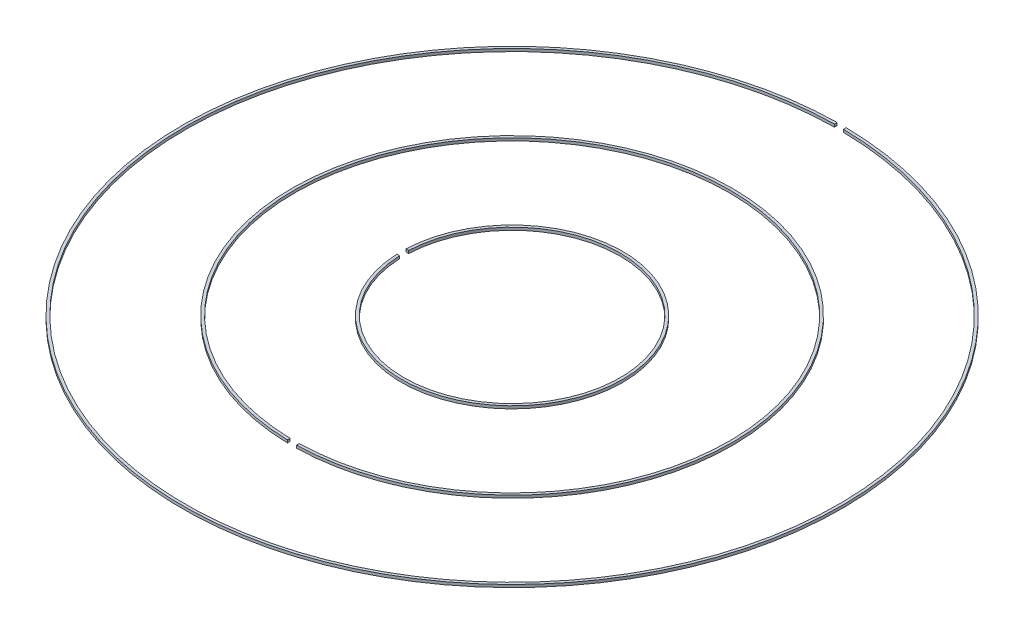
ISO-10303-21;
HEADER;
FILE_DESCRIPTION(('STEP AP214'),'2;1');
FILE_NAME('part.step','',(''),(''),'','','');
FILE_SCHEMA(('AUTOMOTIVE_DESIGN { 1 0 10303 214 1 1 1 1 }'));
ENDSEC;
DATA;
#1=APPLICATION_CONTEXT('core data for automotive mechanical design processes');
#2=APPLICATION_PROTOCOL_DEFINITION('international standard','automotive_design',2000,#1);
#3=PRODUCT_CONTEXT('',#1,'mechanical');
#4=PRODUCT('Part','Part','',(#3));
#5=PRODUCT_RELATED_PRODUCT_CATEGORY('part','',(#4));
#6=PRODUCT_DEFINITION_FORMATION('','',#4);
#7=PRODUCT_DEFINITION_CONTEXT('part definition',#1,'design');
#8=PRODUCT_DEFINITION('design','',#6,#7);
#9=PRODUCT_DEFINITION_SHAPE('','',#8);
#10=(LENGTH_UNIT() NAMED_UNIT(*) SI_UNIT(.MILLI.,.METRE.));
#11=(NAMED_UNIT(*) PLANE_ANGLE_UNIT() SI_UNIT($,.RADIAN.));
#12=(NAMED_UNIT(*) SI_UNIT($,.STERADIAN.) SOLID_ANGLE_UNIT());
#13=UNCERTAINTY_MEASURE_WITH_UNIT(LENGTH_MEASURE(1.E-05),#10,'distance_accuracy_value','');
#14=(GEOMETRIC_REPRESENTATION_CONTEXT(3) GLOBAL_UNCERTAINTY_ASSIGNED_CONTEXT((#13)) GLOBAL_UNIT_ASSIGNED_CONTEXT((#10,
#11,#12)) REPRESENTATION_CONTEXT('',''));
#15=CARTESIAN_POINT('',(0.,0.,0.));
#16=DIRECTION('',(0.,0.,1.));
#17=DIRECTION('',(1.,0.,0.));
#18=AXIS2_PLACEMENT_3D('',#15,#16,#17);
#19=CARTESIAN_POINT('',(-1.43576065945314,0.0359999999999996,0.0600000000000001));
#20=DIRECTION('',(0.,0.,1.));
#21=DIRECTION('',(1.,0.,0.));
#22=AXIS2_PLACEMENT_3D('',#19,#20,#21);
#23=PLANE('',#22);
#24=DIRECTION('',(-1.,0.,0.));
#25=VECTOR('',#24,1.);
#26=CARTESIAN_POINT('',(-1.43576065945314,0.,0.0600000000000001));
#27=LINE('',#26,#25);
#28=CARTESIAN_POINT('',(-1.43576065945314,0.,0.0599999999999996));
#29=VERTEX_POINT('',#28);
#30=CARTESIAN_POINT('',(-1.47176406099207,0.,0.0599999999999997));
#31=VERTEX_POINT('',#30);
#32=EDGE_CURVE('E13',#29,#31,#27,.T.);
#33=ORIENTED_EDGE('',*,*,#32,.T.);
#34=DIRECTION('',(0.,-1.,0.));
#35=VECTOR('',#34,1.);
#36=CARTESIAN_POINT('',(-1.47176406099207,0.0359999999999996,0.0599999999999997));
#37=LINE('',#36,#35);
#38=CARTESIAN_POINT('',(-1.47176406099207,0.0359999999999996,0.0599999999999997));
#39=VERTEX_POINT('',#38);
#40=EDGE_CURVE('E193',#39,#31,#37,.T.);
#41=ORIENTED_EDGE('',*,*,#40,.F.);
#42=DIRECTION('',(-1.,0.,0.));
#43=VECTOR('',#42,1.);
#44=CARTESIAN_POINT('',(-1.43576065945314,0.0359999999999996,0.0600000000000001));
#45=LINE('',#44,#43);
#46=CARTESIAN_POINT('',(-1.43576065945314,0.0359999999999996,0.0599999999999996));
#47=VERTEX_POINT('',#46);
#48=EDGE_CURVE('E126',#47,#39,#45,.T.);
#49=ORIENTED_EDGE('',*,*,#48,.F.);
#50=DIRECTION('',(0.,-1.,0.));
#51=VECTOR('',#50,1.);
#52=CARTESIAN_POINT('',(-1.43576065945314,0.0359999999999996,0.0599999999999996));
#53=LINE('',#52,#51);
#54=EDGE_CURVE('E164',#47,#29,#53,.T.);
#55=ORIENTED_EDGE('',*,*,#54,.T.);
#56=EDGE_LOOP('',(#33,#41,#49,#55));
#57=FACE_BOUND('',#56,.T.);
#58=ADVANCED_FACE('F122',(#57),#23,.F.);
#59=CARTESIAN_POINT('',(0.,0.0359999999999996,0.));
#60=DIRECTION('',(0.,-1.,0.));
#61=DIRECTION('',(0.,0.,-1.));
#62=AXIS2_PLACEMENT_3D('',#59,#60,#61);
#63=CYLINDRICAL_SURFACE('',#62,1.47298657537258);
#64=CARTESIAN_POINT('',(0.,0.,0.));
#65=DIRECTION('',(0.,1.,0.));
#66=DIRECTION('',(0.,0.,1.));
#67=AXIS2_PLACEMENT_3D('',#64,#65,#66);
#68=CIRCLE('',#67,1.47298657537258);
#69=CARTESIAN_POINT('',(-1.47176406099207,0.,-0.0600000000000002));
#70=VERTEX_POINT('',#69);
#71=EDGE_CURVE('E132',#31,#70,#68,.T.);
#72=ORIENTED_EDGE('',*,*,#71,.T.);
#73=DIRECTION('',(0.,-1.,0.));
#74=VECTOR('',#73,1.);
#75=CARTESIAN_POINT('',(-1.47176406099207,0.0359999999999996,-0.0600000000000002));
#76=LINE('',#75,#74);
#77=CARTESIAN_POINT('',(-1.47176406099207,0.0359999999999996,-0.0600000000000002));
#78=VERTEX_POINT('',#77);
#79=EDGE_CURVE('E179',#78,#70,#76,.T.);
#80=ORIENTED_EDGE('',*,*,#79,.F.);
#81=CARTESIAN_POINT('',(0.,0.0359999999999996,0.));
#82=DIRECTION('',(0.,1.,0.));
#83=DIRECTION('',(0.,0.,1.));
#84=AXIS2_PLACEMENT_3D('',#81,#82,#83);
#85=CIRCLE('',#84,1.47298657537258);
#86=EDGE_CURVE('E156',#39,#78,#85,.T.);
#87=ORIENTED_EDGE('',*,*,#86,.F.);
#88=ORIENTED_EDGE('',*,*,#40,.T.);
#89=EDGE_LOOP('',(#72,#80,#87,#88));
#90=FACE_BOUND('',#89,.T.);
#91=ADVANCED_FACE('F196',(#90),#63,.T.);
#92=CARTESIAN_POINT('',(-1.47176406099207,0.0359999999999996,-0.0600000000000001));
#93=DIRECTION('',(0.,0.,-1.));
#94=DIRECTION('',(-1.,0.,0.));
#95=AXIS2_PLACEMENT_3D('',#92,#93,#94);
#96=PLANE('',#95);
#97=DIRECTION('',(1.,0.,0.));
#98=VECTOR('',#97,1.);
#99=CARTESIAN_POINT('',(-1.47176406099207,0.,-0.0600000000000001));
#100=LINE('',#99,#98);
#101=CARTESIAN_POINT('',(-1.43576065945314,0.,-0.06));
#102=VERTEX_POINT('',#101);
#103=EDGE_CURVE('E182',#70,#102,#100,.T.);
#104=ORIENTED_EDGE('',*,*,#103,.T.);
#105=DIRECTION('',(0.,-1.,0.));
#106=VECTOR('',#105,1.);
#107=CARTESIAN_POINT('',(-1.43576065945314,0.0359999999999996,-0.06));
#108=LINE('',#107,#106);
#109=CARTESIAN_POINT('',(-1.43576065945314,0.0359999999999996,-0.06));
#110=VERTEX_POINT('',#109);
#111=EDGE_CURVE('E170',#110,#102,#108,.T.);
#112=ORIENTED_EDGE('',*,*,#111,.F.);
#113=DIRECTION('',(1.,0.,0.));
#114=VECTOR('',#113,1.);
#115=CARTESIAN_POINT('',(-1.47176406099207,0.0359999999999996,-0.0600000000000001));
#116=LINE('',#115,#114);
#117=EDGE_CURVE('E191',#78,#110,#116,.T.);
#118=ORIENTED_EDGE('',*,*,#117,.F.);
#119=ORIENTED_EDGE('',*,*,#79,.T.);
#120=EDGE_LOOP('',(#104,#112,#118,#119));
#121=FACE_BOUND('',#120,.T.);
#122=ADVANCED_FACE('F183',(#121),#96,.F.);
#123=CARTESIAN_POINT('',(0.,0.0359999999999996,0.));
#124=DIRECTION('',(0.,-1.,0.));
#125=DIRECTION('',(0.,0.,-1.));
#126=AXIS2_PLACEMENT_3D('',#123,#124,#125);
#127=CYLINDRICAL_SURFACE('',#126,1.43701380342477);
#128=CARTESIAN_POINT('',(0.,0.,0.));
#129=DIRECTION('',(0.,1.,0.));
#130=DIRECTION('',(0.,0.,1.));
#131=AXIS2_PLACEMENT_3D('',#128,#129,#130);
#132=CIRCLE('',#131,1.43701380342477);
#133=EDGE_CURVE('E174',#29,#102,#132,.T.);
#134=ORIENTED_EDGE('',*,*,#133,.F.);
#135=ORIENTED_EDGE('',*,*,#54,.F.);
#136=CARTESIAN_POINT('',(0.,0.0359999999999996,0.));
#137=DIRECTION('',(0.,1.,0.));
#138=DIRECTION('',(0.,0.,1.));
#139=AXIS2_PLACEMENT_3D('',#136,#137,#138);
#140=CIRCLE('',#139,1.43701380342477);
#141=EDGE_CURVE('E176',#47,#110,#140,.T.);
#142=ORIENTED_EDGE('',*,*,#141,.T.);
#143=ORIENTED_EDGE('',*,*,#111,.T.);
#144=EDGE_LOOP('',(#134,#135,#142,#143));
#145=FACE_BOUND('',#144,.T.);
#146=ADVANCED_FACE('F172',(#145),#127,.F.);
#147=CARTESIAN_POINT('',(0.,0.0359999999999996,0.));
#148=DIRECTION('',(0.,1.,0.));
#149=DIRECTION('',(0.,0.,1.));
#150=AXIS2_PLACEMENT_3D('',#147,#148,#149);
#151=PLANE('',#150);
#152=ORIENTED_EDGE('',*,*,#48,.T.);
#153=ORIENTED_EDGE('',*,*,#86,.T.);
#154=ORIENTED_EDGE('',*,*,#117,.T.);
#155=ORIENTED_EDGE('',*,*,#141,.F.);
#156=EDGE_LOOP('',(#152,#153,#154,#155));
#157=FACE_BOUND('',#156,.T.);
#158=ADVANCED_FACE('F124',(#157),#151,.T.);
#159=CARTESIAN_POINT('',(0.,0.,0.));
#160=DIRECTION('',(0.,1.,0.));
#161=DIRECTION('',(0.,0.,1.));
#162=AXIS2_PLACEMENT_3D('',#159,#160,#161);
#163=PLANE('',#162);
#164=ORIENTED_EDGE('',*,*,#32,.F.);
#165=ORIENTED_EDGE('',*,*,#133,.T.);
#166=ORIENTED_EDGE('',*,*,#103,.F.);
#167=ORIENTED_EDGE('',*,*,#71,.F.);
#168=EDGE_LOOP('',(#164,#165,#166,#167));
#169=FACE_BOUND('',#168,.T.);
#170=ADVANCED_FACE('F185',(#169),#163,.F.);
#171=CLOSED_SHELL('',(#58,#91,#122,#146,#158,#170));
#172=MANIFOLD_SOLID_BREP('B2',#171);
#173=CARTESIAN_POINT('',(0.06,0.0359999999999996,2.89137967677457));
#174=DIRECTION('',(1.,0.,0.));
#175=DIRECTION('',(0.,0.,-1.));
#176=AXIS2_PLACEMENT_3D('',#173,#174,#175);
#177=PLANE('',#176);
#178=DIRECTION('',(0.,0.,1.));
#179=VECTOR('',#178,1.);
#180=CARTESIAN_POINT('',(0.06,0.,2.89137967677457));
#181=LINE('',#180,#179);
#182=CARTESIAN_POINT('',(0.0600000000000001,0.,2.89137967677457));
#183=VERTEX_POINT('',#182);
#184=CARTESIAN_POINT('',(0.06,0.,2.92738307831349));
#185=VERTEX_POINT('',#184);
#186=EDGE_CURVE('E120',#183,#185,#181,.T.);
#187=ORIENTED_EDGE('',*,*,#186,.T.);
#188=DIRECTION('',(0.,-1.,0.));
#189=VECTOR('',#188,1.);
#190=CARTESIAN_POINT('',(0.06,0.0359999999999996,2.92738307831349));
#191=LINE('',#190,#189);
#192=CARTESIAN_POINT('',(0.06,0.0359999999999996,2.92738307831349));
#193=VERTEX_POINT('',#192);
#194=EDGE_CURVE('E326',#193,#185,#191,.T.);
#195=ORIENTED_EDGE('',*,*,#194,.F.);
#196=DIRECTION('',(0.,0.,1.));
#197=VECTOR('',#196,1.);
#198=CARTESIAN_POINT('',(0.06,0.0359999999999996,2.89137967677457));
#199=LINE('',#198,#197);
#200=CARTESIAN_POINT('',(0.0600000000000001,0.0359999999999996,2.89137967677457));
#201=VERTEX_POINT('',#200);
#202=EDGE_CURVE('E259',#201,#193,#199,.T.);
#203=ORIENTED_EDGE('',*,*,#202,.F.);
#204=DIRECTION('',(0.,-1.,0.));
#205=VECTOR('',#204,1.);
#206=CARTESIAN_POINT('',(0.0600000000000001,0.0359999999999996,2.89137967677457));
#207=LINE('',#206,#205);
#208=EDGE_CURVE('E299',#201,#183,#207,.T.);
#209=ORIENTED_EDGE('',*,*,#208,.T.);
#210=EDGE_LOOP('',(#187,#195,#203,#209));
#211=FACE_BOUND('',#210,.T.);
#212=ADVANCED_FACE('F255',(#211),#177,.F.);
#213=CARTESIAN_POINT('',(0.,0.0359999999999996,0.));
#214=DIRECTION('',(0.,-1.,0.));
#215=DIRECTION('',(0.,0.,-1.));
#216=AXIS2_PLACEMENT_3D('',#213,#214,#215);
#217=CYLINDRICAL_SURFACE('',#216,2.92799789740296);
#218=CARTESIAN_POINT('',(0.,0.,0.));
#219=DIRECTION('',(0.,1.,0.));
#220=DIRECTION('',(0.,0.,1.));
#221=AXIS2_PLACEMENT_3D('',#218,#219,#220);
#222=CIRCLE('',#221,2.92799789740296);
#223=CARTESIAN_POINT('',(-0.0599999999999996,0.,2.92738307831349));
#224=VERTEX_POINT('',#223);
#225=EDGE_CURVE('E265',#185,#224,#222,.T.);
#226=ORIENTED_EDGE('',*,*,#225,.T.);
#227=DIRECTION('',(0.,-1.,0.));
#228=VECTOR('',#227,1.);
#229=CARTESIAN_POINT('',(-0.0599999999999996,0.0359999999999996,2.92738307831349));
#230=LINE('',#229,#228);
#231=CARTESIAN_POINT('',(-0.0599999999999996,0.0359999999999996,2.92738307831349));
#232=VERTEX_POINT('',#231);
#233=EDGE_CURVE('E313',#232,#224,#230,.T.);
#234=ORIENTED_EDGE('',*,*,#233,.F.);
#235=CARTESIAN_POINT('',(0.,0.0359999999999996,0.));
#236=DIRECTION('',(0.,1.,0.));
#237=DIRECTION('',(0.,0.,1.));
#238=AXIS2_PLACEMENT_3D('',#235,#236,#237);
#239=CIRCLE('',#238,2.92799789740296);
#240=EDGE_CURVE('E291',#193,#232,#239,.T.);
#241=ORIENTED_EDGE('',*,*,#240,.F.);
#242=ORIENTED_EDGE('',*,*,#194,.T.);
#243=EDGE_LOOP('',(#226,#234,#241,#242));
#244=FACE_BOUND('',#243,.T.);
#245=ADVANCED_FACE('F329',(#244),#217,.T.);
#246=CARTESIAN_POINT('',(-0.06,0.0359999999999996,2.89137967677457));
#247=DIRECTION('',(1.,0.,0.));
#248=DIRECTION('',(0.,0.,-1.));
#249=AXIS2_PLACEMENT_3D('',#246,#247,#248);
#250=PLANE('',#249);
#251=DIRECTION('',(0.,0.,1.));
#252=VECTOR('',#251,1.);
#253=CARTESIAN_POINT('',(-0.06,0.,2.89137967677457));
#254=LINE('',#253,#252);
#255=CARTESIAN_POINT('',(-0.06,0.,2.89137967677457));
#256=VERTEX_POINT('',#255);
#257=EDGE_CURVE('E315',#256,#224,#254,.T.);
#258=ORIENTED_EDGE('',*,*,#257,.F.);
#259=DIRECTION('',(0.,-1.,0.));
#260=VECTOR('',#259,1.);
#261=CARTESIAN_POINT('',(-0.06,0.0359999999999996,2.89137967677457));
#262=LINE('',#261,#260);
#263=CARTESIAN_POINT('',(-0.06,0.0359999999999996,2.89137967677457));
#264=VERTEX_POINT('',#263);
#265=EDGE_CURVE('E304',#264,#256,#262,.T.);
#266=ORIENTED_EDGE('',*,*,#265,.F.);
#267=DIRECTION('',(0.,0.,1.));
#268=VECTOR('',#267,1.);
#269=CARTESIAN_POINT('',(-0.06,0.0359999999999996,2.89137967677457));
#270=LINE('',#269,#268);
#271=EDGE_CURVE('E324',#264,#232,#270,.T.);
#272=ORIENTED_EDGE('',*,*,#271,.T.);
#273=ORIENTED_EDGE('',*,*,#233,.T.);
#274=EDGE_LOOP('',(#258,#266,#272,#273));
#275=FACE_BOUND('',#274,.T.);
#276=ADVANCED_FACE('F316',(#275),#250,.T.);
#277=CARTESIAN_POINT('',(0.,0.0359999999999996,0.));
#278=DIRECTION('',(0.,-1.,0.));
#279=DIRECTION('',(0.,0.,-1.));
#280=AXIS2_PLACEMENT_3D('',#277,#278,#279);
#281=CYLINDRICAL_SURFACE('',#280,2.89200214994129);
#282=CARTESIAN_POINT('',(0.,0.,0.));
#283=DIRECTION('',(0.,1.,0.));
#284=DIRECTION('',(0.,0.,1.));
#285=AXIS2_PLACEMENT_3D('',#282,#283,#284);
#286=CIRCLE('',#285,2.89200214994129);
#287=EDGE_CURVE('E308',#183,#256,#286,.T.);
#288=ORIENTED_EDGE('',*,*,#287,.F.);
#289=ORIENTED_EDGE('',*,*,#208,.F.);
#290=CARTESIAN_POINT('',(0.,0.0359999999999996,0.));
#291=DIRECTION('',(0.,1.,0.));
#292=DIRECTION('',(0.,0.,1.));
#293=AXIS2_PLACEMENT_3D('',#290,#291,#292);
#294=CIRCLE('',#293,2.89200214994129);
#295=EDGE_CURVE('E310',#201,#264,#294,.T.);
#296=ORIENTED_EDGE('',*,*,#295,.T.);
#297=ORIENTED_EDGE('',*,*,#265,.T.);
#298=EDGE_LOOP('',(#288,#289,#296,#297));
#299=FACE_BOUND('',#298,.T.);
#300=ADVANCED_FACE('F306',(#299),#281,.F.);
#301=CARTESIAN_POINT('',(0.,0.0359999999999996,0.));
#302=DIRECTION('',(0.,1.,0.));
#303=DIRECTION('',(0.,0.,1.));
#304=AXIS2_PLACEMENT_3D('',#301,#302,#303);
#305=PLANE('',#304);
#306=ORIENTED_EDGE('',*,*,#202,.T.);
#307=ORIENTED_EDGE('',*,*,#240,.T.);
#308=ORIENTED_EDGE('',*,*,#271,.F.);
#309=ORIENTED_EDGE('',*,*,#295,.F.);
#310=EDGE_LOOP('',(#306,#307,#308,#309));
#311=FACE_BOUND('',#310,.T.);
#312=ADVANCED_FACE('F257',(#311),#305,.T.);
#313=CARTESIAN_POINT('',(0.,0.,0.));
#314=DIRECTION('',(0.,1.,0.));
#315=DIRECTION('',(0.,0.,1.));
#316=AXIS2_PLACEMENT_3D('',#313,#314,#315);
#317=PLANE('',#316);
#318=ORIENTED_EDGE('',*,*,#186,.F.);
#319=ORIENTED_EDGE('',*,*,#287,.T.);
#320=ORIENTED_EDGE('',*,*,#257,.T.);
#321=ORIENTED_EDGE('',*,*,#225,.F.);
#322=EDGE_LOOP('',(#318,#319,#320,#321));
#323=FACE_BOUND('',#322,.T.);
#324=ADVANCED_FACE('F318',(#323),#317,.F.);
#325=CLOSED_SHELL('',(#212,#245,#276,#300,#312,#324));
#326=MANIFOLD_SOLID_BREP('B7',#325);
#327=CARTESIAN_POINT('',(-0.06,0.0359999999999996,-4.3825893101548));
#328=DIRECTION('',(1.,0.,0.));
#329=DIRECTION('',(0.,0.,-1.));
#330=AXIS2_PLACEMENT_3D('',#327,#328,#329);
#331=PLANE('',#330);
#332=DIRECTION('',(0.,0.,1.));
#333=VECTOR('',#332,1.);
#334=CARTESIAN_POINT('',(-0.06,0.,-4.3825893101548));
#335=LINE('',#334,#333);
#336=CARTESIAN_POINT('',(-0.0599999999999995,0.,-4.3825893101548));
#337=VERTEX_POINT('',#336);
#338=CARTESIAN_POINT('',(-0.0599999999999997,0.,-4.34658590861588));
#339=VERTEX_POINT('',#338);
#340=EDGE_CURVE('E450',#337,#339,#335,.T.);
#341=ORIENTED_EDGE('',*,*,#340,.F.);
#342=DIRECTION('',(0.,-1.,0.));
#343=VECTOR('',#342,1.);
#344=CARTESIAN_POINT('',(-0.0599999999999995,0.0359999999999996,-4.3825893101548));
#345=LINE('',#344,#343);
#346=CARTESIAN_POINT('',(-0.0599999999999995,0.0359999999999996,-4.3825893101548));
#347=VERTEX_POINT('',#346);
#348=EDGE_CURVE('E253',#347,#337,#345,.T.);
#349=ORIENTED_EDGE('',*,*,#348,.F.);
#350=DIRECTION('',(0.,0.,1.));
#351=VECTOR('',#350,1.);
#352=CARTESIAN_POINT('',(-0.06,0.0359999999999996,-4.3825893101548));
#353=LINE('',#352,#351);
#354=CARTESIAN_POINT('',(-0.0599999999999997,0.0359999999999996,-4.34658590861588));
#355=VERTEX_POINT('',#354);
#356=EDGE_CURVE('E443',#347,#355,#353,.T.);
#357=ORIENTED_EDGE('',*,*,#356,.T.);
#358=DIRECTION('',(0.,-1.,0.));
#359=VECTOR('',#358,1.);
#360=CARTESIAN_POINT('',(-0.0599999999999997,0.0359999999999996,-4.34658590861588));
#361=LINE('',#360,#359);
#362=EDGE_CURVE('E382',#355,#339,#361,.T.);
#363=ORIENTED_EDGE('',*,*,#362,.T.);
#364=EDGE_LOOP('',(#341,#349,#357,#363));
#365=FACE_BOUND('',#364,.T.);
#366=ADVANCED_FACE('F379',(#365),#331,.T.);
#367=CARTESIAN_POINT('',(0.,0.0359999999999996,0.));
#368=DIRECTION('',(0.,-1.,0.));
#369=DIRECTION('',(0.,0.,-1.));
#370=AXIS2_PLACEMENT_3D('',#367,#368,#369);
#371=CYLINDRICAL_SURFACE('',#370,4.38300000701382);
#372=CARTESIAN_POINT('',(0.,0.,0.));
#373=DIRECTION('',(0.,1.,0.));
#374=DIRECTION('',(0.,0.,1.));
#375=AXIS2_PLACEMENT_3D('',#372,#373,#374);
#376=CIRCLE('',#375,4.38300000701382);
#377=CARTESIAN_POINT('',(0.0599999999999988,0.,-4.3825893101548));
#378=VERTEX_POINT('',#377);
#379=EDGE_CURVE('E413',#337,#378,#376,.T.);
#380=ORIENTED_EDGE('',*,*,#379,.T.);
#381=DIRECTION('',(0.,-1.,0.));
#382=VECTOR('',#381,1.);
#383=CARTESIAN_POINT('',(0.0599999999999988,0.0359999999999996,-4.3825893101548));
#384=LINE('',#383,#382);
#385=CARTESIAN_POINT('',(0.0599999999999988,0.0359999999999996,-4.3825893101548));
#386=VERTEX_POINT('',#385);
#387=EDGE_CURVE('E389',#386,#378,#384,.T.);
#388=ORIENTED_EDGE('',*,*,#387,.F.);
#389=CARTESIAN_POINT('',(0.,0.0359999999999996,0.));
#390=DIRECTION('',(0.,1.,0.));
#391=DIRECTION('',(0.,0.,1.));
#392=AXIS2_PLACEMENT_3D('',#389,#390,#391);
#393=CIRCLE('',#392,4.38300000701382);
#394=EDGE_CURVE('E430',#347,#386,#393,.T.);
#395=ORIENTED_EDGE('',*,*,#394,.F.);
#396=ORIENTED_EDGE('',*,*,#348,.T.);
#397=EDGE_LOOP('',(#380,#388,#395,#396));
#398=FACE_BOUND('',#397,.T.);
#399=ADVANCED_FACE('F466',(#398),#371,.T.);
#400=CARTESIAN_POINT('',(0.06,0.0359999999999996,-4.3825893101548));
#401=DIRECTION('',(1.,0.,0.));
#402=DIRECTION('',(0.,0.,-1.));
#403=AXIS2_PLACEMENT_3D('',#400,#401,#402);
#404=PLANE('',#403);
#405=DIRECTION('',(0.,0.,1.));
#406=VECTOR('',#405,1.);
#407=CARTESIAN_POINT('',(0.06,0.,-4.3825893101548));
#408=LINE('',#407,#406);
#409=CARTESIAN_POINT('',(0.06,0.,-4.34658590861588));
#410=VERTEX_POINT('',#409);
#411=EDGE_CURVE('E438',#378,#410,#408,.T.);
#412=ORIENTED_EDGE('',*,*,#411,.T.);
#413=DIRECTION('',(0.,-1.,0.));
#414=VECTOR('',#413,1.);
#415=CARTESIAN_POINT('',(0.06,0.0359999999999996,-4.34658590861588));
#416=LINE('',#415,#414);
#417=CARTESIAN_POINT('',(0.06,0.0359999999999996,-4.34658590861588));
#418=VERTEX_POINT('',#417);
#419=EDGE_CURVE('E435',#418,#410,#416,.T.);
#420=ORIENTED_EDGE('',*,*,#419,.F.);
#421=DIRECTION('',(0.,0.,1.));
#422=VECTOR('',#421,1.);
#423=CARTESIAN_POINT('',(0.06,0.0359999999999996,-4.3825893101548));
#424=LINE('',#423,#422);
#425=EDGE_CURVE('E425',#386,#418,#424,.T.);
#426=ORIENTED_EDGE('',*,*,#425,.F.);
#427=ORIENTED_EDGE('',*,*,#387,.T.);
#428=EDGE_LOOP('',(#412,#420,#426,#427));
#429=FACE_BOUND('',#428,.T.);
#430=ADVANCED_FACE('F436',(#429),#404,.F.);
#431=CARTESIAN_POINT('',(0.,0.0359999999999996,0.));
#432=DIRECTION('',(0.,-1.,0.));
#433=DIRECTION('',(0.,0.,-1.));
#434=AXIS2_PLACEMENT_3D('',#431,#432,#433);
#435=CYLINDRICAL_SURFACE('',#434,4.34700000701381);
#436=CARTESIAN_POINT('',(0.,0.,0.));
#437=DIRECTION('',(0.,1.,0.));
#438=DIRECTION('',(0.,0.,1.));
#439=AXIS2_PLACEMENT_3D('',#436,#437,#438);
#440=CIRCLE('',#439,4.34700000701381);
#441=EDGE_CURVE('E454',#339,#410,#440,.T.);
#442=ORIENTED_EDGE('',*,*,#441,.F.);
#443=ORIENTED_EDGE('',*,*,#362,.F.);
#444=CARTESIAN_POINT('',(0.,0.0359999999999996,0.));
#445=DIRECTION('',(0.,1.,0.));
#446=DIRECTION('',(0.,0.,1.));
#447=AXIS2_PLACEMENT_3D('',#444,#445,#446);
#448=CIRCLE('',#447,4.34700000701381);
#449=EDGE_CURVE('E429',#355,#418,#448,.T.);
#450=ORIENTED_EDGE('',*,*,#449,.T.);
#451=ORIENTED_EDGE('',*,*,#419,.T.);
#452=EDGE_LOOP('',(#442,#443,#450,#451));
#453=FACE_BOUND('',#452,.T.);
#454=ADVANCED_FACE('F441',(#453),#435,.F.);
#455=CARTESIAN_POINT('',(0.,0.0359999999999996,0.));
#456=DIRECTION('',(0.,1.,0.));
#457=DIRECTION('',(0.,0.,1.));
#458=AXIS2_PLACEMENT_3D('',#455,#456,#457);
#459=PLANE('',#458);
#460=ORIENTED_EDGE('',*,*,#356,.F.);
#461=ORIENTED_EDGE('',*,*,#394,.T.);
#462=ORIENTED_EDGE('',*,*,#425,.T.);
#463=ORIENTED_EDGE('',*,*,#449,.F.);
#464=EDGE_LOOP('',(#460,#461,#462,#463));
#465=FACE_BOUND('',#464,.T.);
#466=ADVANCED_FACE('F428',(#465),#459,.T.);
#467=CARTESIAN_POINT('',(0.,0.,0.));
#468=DIRECTION('',(0.,1.,0.));
#469=DIRECTION('',(0.,0.,1.));
#470=AXIS2_PLACEMENT_3D('',#467,#468,#469);
#471=PLANE('',#470);
#472=ORIENTED_EDGE('',*,*,#340,.T.);
#473=ORIENTED_EDGE('',*,*,#441,.T.);
#474=ORIENTED_EDGE('',*,*,#411,.F.);
#475=ORIENTED_EDGE('',*,*,#379,.F.);
#476=EDGE_LOOP('',(#472,#473,#474,#475));
#477=FACE_BOUND('',#476,.T.);
#478=ADVANCED_FACE('F463',(#477),#471,.F.);
#479=CLOSED_SHELL('',(#366,#399,#430,#454,#466,#478));
#480=MANIFOLD_SOLID_BREP('B114',#479);
#481=ADVANCED_BREP_SHAPE_REPRESENTATION('',(#18,#172,#326,#480),#14);
#482=SHAPE_DEFINITION_REPRESENTATION(#9,#481);
ENDSEC;
END-ISO-10303-21;
